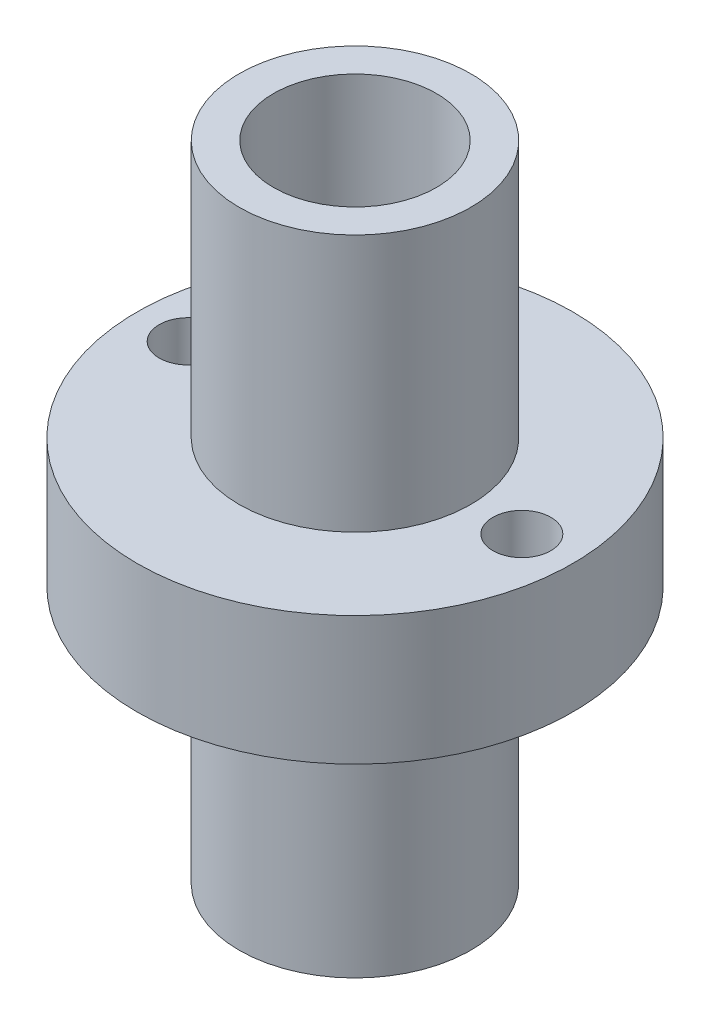
ISO-10303-21;
HEADER;
FILE_DESCRIPTION(('STEP AP214'),'2;1');
FILE_NAME('part.step','',(''),(''),'','','');
FILE_SCHEMA(('AUTOMOTIVE_DESIGN { 1 0 10303 214 1 1 1 1 }'));
ENDSEC;
DATA;
#1=APPLICATION_CONTEXT('core data for automotive mechanical design processes');
#2=APPLICATION_PROTOCOL_DEFINITION('international standard','automotive_design',2000,#1);
#3=PRODUCT_CONTEXT('',#1,'mechanical');
#4=PRODUCT('Part','Part','',(#3));
#5=PRODUCT_RELATED_PRODUCT_CATEGORY('part','',(#4));
#6=PRODUCT_DEFINITION_FORMATION('','',#4);
#7=PRODUCT_DEFINITION_CONTEXT('part definition',#1,'design');
#8=PRODUCT_DEFINITION('design','',#6,#7);
#9=PRODUCT_DEFINITION_SHAPE('','',#8);
#10=(LENGTH_UNIT() NAMED_UNIT(*) SI_UNIT(.MILLI.,.METRE.));
#11=(NAMED_UNIT(*) PLANE_ANGLE_UNIT() SI_UNIT($,.RADIAN.));
#12=(NAMED_UNIT(*) SI_UNIT($,.STERADIAN.) SOLID_ANGLE_UNIT());
#13=UNCERTAINTY_MEASURE_WITH_UNIT(LENGTH_MEASURE(1.E-05),#10,'distance_accuracy_value','');
#14=(GEOMETRIC_REPRESENTATION_CONTEXT(3) GLOBAL_UNCERTAINTY_ASSIGNED_CONTEXT((#13)) GLOBAL_UNIT_ASSIGNED_CONTEXT((#10,
#11,#12)) REPRESENTATION_CONTEXT('',''));
#15=CARTESIAN_POINT('',(0.,0.,0.));
#16=DIRECTION('',(0.,0.,1.));
#17=DIRECTION('',(1.,0.,0.));
#18=AXIS2_PLACEMENT_3D('',#15,#16,#17);
#19=CARTESIAN_POINT('',(13.5,37.5,0.));
#20=DIRECTION('',(0.,-1.,0.));
#21=DIRECTION('',(0.,0.,-1.));
#22=AXIS2_PLACEMENT_3D('',#19,#20,#21);
#23=PLANE('',#22);
#24=CARTESIAN_POINT('',(0.,37.5,0.));
#25=DIRECTION('',(0.,1.,0.));
#26=DIRECTION('',(0.,0.,1.));
#27=AXIS2_PLACEMENT_3D('',#24,#25,#26);
#28=CIRCLE('',#27,9.50000000000001);
#29=CARTESIAN_POINT('',(0.,37.5,9.50000000000001));
#30=VERTEX_POINT('',#29);
#31=EDGE_CURVE('E10',#30,#30,#28,.T.);
#32=ORIENTED_EDGE('',*,*,#31,.F.);
#33=EDGE_LOOP('',(#32));
#34=FACE_BOUND('',#33,.T.);
#35=CARTESIAN_POINT('',(0.,37.5,0.));
#36=DIRECTION('',(0.,1.,0.));
#37=DIRECTION('',(0.,0.,1.));
#38=AXIS2_PLACEMENT_3D('',#35,#36,#37);
#39=CIRCLE('',#38,13.5);
#40=CARTESIAN_POINT('',(0.,37.5,13.5));
#41=VERTEX_POINT('',#40);
#42=EDGE_CURVE('E59',#41,#41,#39,.T.);
#43=ORIENTED_EDGE('',*,*,#42,.T.);
#44=EDGE_LOOP('',(#43));
#45=FACE_BOUND('',#44,.T.);
#46=ADVANCED_FACE('F31',(#34,#45),#23,.F.);
#47=CARTESIAN_POINT('',(0.,0.,0.));
#48=DIRECTION('',(0.,1.,0.));
#49=DIRECTION('',(0.,0.,1.));
#50=AXIS2_PLACEMENT_3D('',#47,#48,#49);
#51=CYLINDRICAL_SURFACE('',#50,9.50000000000001);
#52=CARTESIAN_POINT('',(0.,-37.5,0.));
#53=DIRECTION('',(0.,1.,0.));
#54=DIRECTION('',(0.,0.,1.));
#55=AXIS2_PLACEMENT_3D('',#52,#53,#54);
#56=CIRCLE('',#55,9.50000000000001);
#57=CARTESIAN_POINT('',(0.,-37.5,9.50000000000001));
#58=VERTEX_POINT('',#57);
#59=EDGE_CURVE('E37',#58,#58,#56,.T.);
#60=ORIENTED_EDGE('',*,*,#59,.F.);
#61=EDGE_LOOP('',(#60));
#62=FACE_BOUND('',#61,.T.);
#63=ORIENTED_EDGE('',*,*,#31,.T.);
#64=EDGE_LOOP('',(#63));
#65=FACE_BOUND('',#64,.T.);
#66=ADVANCED_FACE('F110',(#62,#65),#51,.F.);
#67=CARTESIAN_POINT('',(13.5,-37.5,0.));
#68=DIRECTION('',(0.,1.,0.));
#69=DIRECTION('',(0.,0.,1.));
#70=AXIS2_PLACEMENT_3D('',#67,#68,#69);
#71=PLANE('',#70);
#72=CARTESIAN_POINT('',(0.,-37.5,0.));
#73=DIRECTION('',(0.,1.,0.));
#74=DIRECTION('',(0.,0.,1.));
#75=AXIS2_PLACEMENT_3D('',#72,#73,#74);
#76=CIRCLE('',#75,13.5);
#77=CARTESIAN_POINT('',(0.,-37.5,13.5));
#78=VERTEX_POINT('',#77);
#79=EDGE_CURVE('E41',#78,#78,#76,.T.);
#80=ORIENTED_EDGE('',*,*,#79,.F.);
#81=EDGE_LOOP('',(#80));
#82=FACE_BOUND('',#81,.T.);
#83=ORIENTED_EDGE('',*,*,#59,.T.);
#84=EDGE_LOOP('',(#83));
#85=FACE_BOUND('',#84,.T.);
#86=ADVANCED_FACE('F105',(#82,#85),#71,.F.);
#87=CARTESIAN_POINT('',(0.,0.,0.));
#88=DIRECTION('',(0.,1.,0.));
#89=DIRECTION('',(0.,0.,1.));
#90=AXIS2_PLACEMENT_3D('',#87,#88,#89);
#91=CYLINDRICAL_SURFACE('',#90,13.5);
#92=CARTESIAN_POINT('',(0.,-7.5,0.));
#93=DIRECTION('',(0.,1.,0.));
#94=DIRECTION('',(0.,0.,1.));
#95=AXIS2_PLACEMENT_3D('',#92,#93,#94);
#96=CIRCLE('',#95,13.5);
#97=CARTESIAN_POINT('',(0.,-7.5,13.5));
#98=VERTEX_POINT('',#97);
#99=EDGE_CURVE('E45',#98,#98,#96,.T.);
#100=ORIENTED_EDGE('',*,*,#99,.F.);
#101=EDGE_LOOP('',(#100));
#102=FACE_BOUND('',#101,.T.);
#103=ORIENTED_EDGE('',*,*,#79,.T.);
#104=EDGE_LOOP('',(#103));
#105=FACE_BOUND('',#104,.T.);
#106=ADVANCED_FACE('F98',(#102,#105),#91,.T.);
#107=CARTESIAN_POINT('',(25.4,-7.5,0.));
#108=DIRECTION('',(0.,1.,0.));
#109=DIRECTION('',(0.,0.,1.));
#110=AXIS2_PLACEMENT_3D('',#107,#108,#109);
#111=PLANE('',#110);
#112=CARTESIAN_POINT('',(19.45,-7.5,0.));
#113=DIRECTION('',(0.,1.,0.));
#114=DIRECTION('',(0.,0.,1.));
#115=AXIS2_PLACEMENT_3D('',#112,#113,#114);
#116=CIRCLE('',#115,3.37819999999999);
#117=CARTESIAN_POINT('',(19.45,-7.5,3.37819999999999));
#118=VERTEX_POINT('',#117);
#119=EDGE_CURVE('E68',#118,#118,#116,.T.);
#120=ORIENTED_EDGE('',*,*,#119,.T.);
#121=EDGE_LOOP('',(#120));
#122=FACE_BOUND('',#121,.T.);
#123=CARTESIAN_POINT('',(-19.45,-7.5,0.));
#124=DIRECTION('',(0.,1.,0.));
#125=DIRECTION('',(0.,0.,1.));
#126=AXIS2_PLACEMENT_3D('',#123,#124,#125);
#127=CIRCLE('',#126,3.37819999999999);
#128=CARTESIAN_POINT('',(-19.45,-7.5,3.37819999999999));
#129=VERTEX_POINT('',#128);
#130=EDGE_CURVE('E62',#129,#129,#127,.T.);
#131=ORIENTED_EDGE('',*,*,#130,.T.);
#132=EDGE_LOOP('',(#131));
#133=FACE_BOUND('',#132,.T.);
#134=CARTESIAN_POINT('',(0.,-7.5,0.));
#135=DIRECTION('',(0.,1.,0.));
#136=DIRECTION('',(0.,0.,1.));
#137=AXIS2_PLACEMENT_3D('',#134,#135,#136);
#138=CIRCLE('',#137,25.4);
#139=CARTESIAN_POINT('',(0.,-7.5,25.4));
#140=VERTEX_POINT('',#139);
#141=EDGE_CURVE('E50',#140,#140,#138,.T.);
#142=ORIENTED_EDGE('',*,*,#141,.F.);
#143=EDGE_LOOP('',(#142));
#144=FACE_BOUND('',#143,.T.);
#145=ORIENTED_EDGE('',*,*,#99,.T.);
#146=EDGE_LOOP('',(#145));
#147=FACE_BOUND('',#146,.T.);
#148=ADVANCED_FACE('F92',(#122,#133,#144,#147),#111,.F.);
#149=CARTESIAN_POINT('',(0.,0.,0.));
#150=DIRECTION('',(0.,1.,0.));
#151=DIRECTION('',(0.,0.,1.));
#152=AXIS2_PLACEMENT_3D('',#149,#150,#151);
#153=CYLINDRICAL_SURFACE('',#152,25.4);
#154=CARTESIAN_POINT('',(0.,7.5,0.));
#155=DIRECTION('',(0.,1.,0.));
#156=DIRECTION('',(0.,0.,1.));
#157=AXIS2_PLACEMENT_3D('',#154,#155,#156);
#158=CIRCLE('',#157,25.4);
#159=CARTESIAN_POINT('',(0.,7.5,25.4));
#160=VERTEX_POINT('',#159);
#161=EDGE_CURVE('E53',#160,#160,#158,.T.);
#162=ORIENTED_EDGE('',*,*,#161,.F.);
#163=EDGE_LOOP('',(#162));
#164=FACE_BOUND('',#163,.T.);
#165=ORIENTED_EDGE('',*,*,#141,.T.);
#166=EDGE_LOOP('',(#165));
#167=FACE_BOUND('',#166,.T.);
#168=ADVANCED_FACE('F82',(#164,#167),#153,.T.);
#169=CARTESIAN_POINT('',(25.4,7.5,0.));
#170=DIRECTION('',(0.,-1.,0.));
#171=DIRECTION('',(0.,0.,-1.));
#172=AXIS2_PLACEMENT_3D('',#169,#170,#171);
#173=PLANE('',#172);
#174=CARTESIAN_POINT('',(19.45,7.5,0.));
#175=DIRECTION('',(0.,1.,0.));
#176=DIRECTION('',(0.,0.,1.));
#177=AXIS2_PLACEMENT_3D('',#174,#175,#176);
#178=CIRCLE('',#177,3.37819999999999);
#179=CARTESIAN_POINT('',(19.45,7.5,3.37819999999999));
#180=VERTEX_POINT('',#179);
#181=EDGE_CURVE('E71',#180,#180,#178,.T.);
#182=ORIENTED_EDGE('',*,*,#181,.F.);
#183=EDGE_LOOP('',(#182));
#184=FACE_BOUND('',#183,.T.);
#185=CARTESIAN_POINT('',(-19.45,7.5,0.));
#186=DIRECTION('',(0.,1.,0.));
#187=DIRECTION('',(0.,0.,1.));
#188=AXIS2_PLACEMENT_3D('',#185,#186,#187);
#189=CIRCLE('',#188,3.37819999999999);
#190=CARTESIAN_POINT('',(-19.45,7.5,3.37819999999999));
#191=VERTEX_POINT('',#190);
#192=EDGE_CURVE('E65',#191,#191,#189,.T.);
#193=ORIENTED_EDGE('',*,*,#192,.F.);
#194=EDGE_LOOP('',(#193));
#195=FACE_BOUND('',#194,.T.);
#196=CARTESIAN_POINT('',(0.,7.5,0.));
#197=DIRECTION('',(0.,1.,0.));
#198=DIRECTION('',(0.,0.,1.));
#199=AXIS2_PLACEMENT_3D('',#196,#197,#198);
#200=CIRCLE('',#199,13.5);
#201=CARTESIAN_POINT('',(0.,7.5,13.5));
#202=VERTEX_POINT('',#201);
#203=EDGE_CURVE('E56',#202,#202,#200,.T.);
#204=ORIENTED_EDGE('',*,*,#203,.F.);
#205=EDGE_LOOP('',(#204));
#206=FACE_BOUND('',#205,.T.);
#207=ORIENTED_EDGE('',*,*,#161,.T.);
#208=EDGE_LOOP('',(#207));
#209=FACE_BOUND('',#208,.T.);
#210=ADVANCED_FACE('F78',(#184,#195,#206,#209),#173,.F.);
#211=CARTESIAN_POINT('',(0.,0.,0.));
#212=DIRECTION('',(0.,1.,0.));
#213=DIRECTION('',(0.,0.,1.));
#214=AXIS2_PLACEMENT_3D('',#211,#212,#213);
#215=CYLINDRICAL_SURFACE('',#214,13.5);
#216=ORIENTED_EDGE('',*,*,#42,.F.);
#217=EDGE_LOOP('',(#216));
#218=FACE_BOUND('',#217,.T.);
#219=ORIENTED_EDGE('',*,*,#203,.T.);
#220=EDGE_LOOP('',(#219));
#221=FACE_BOUND('',#220,.T.);
#222=ADVANCED_FACE('F81',(#218,#221),#215,.T.);
#223=CARTESIAN_POINT('',(-19.45,7.5,0.));
#224=DIRECTION('',(0.,1.,0.));
#225=DIRECTION('',(0.,0.,1.));
#226=AXIS2_PLACEMENT_3D('',#223,#224,#225);
#227=CYLINDRICAL_SURFACE('',#226,3.37819999999999);
#228=ORIENTED_EDGE('',*,*,#192,.T.);
#229=EDGE_LOOP('',(#228));
#230=FACE_BOUND('',#229,.T.);
#231=ORIENTED_EDGE('',*,*,#130,.F.);
#232=EDGE_LOOP('',(#231));
#233=FACE_BOUND('',#232,.T.);
#234=ADVANCED_FACE('F125',(#230,#233),#227,.F.);
#235=CARTESIAN_POINT('',(19.45,7.5,0.));
#236=DIRECTION('',(0.,1.,0.));
#237=DIRECTION('',(0.,0.,1.));
#238=AXIS2_PLACEMENT_3D('',#235,#236,#237);
#239=CYLINDRICAL_SURFACE('',#238,3.37819999999999);
#240=ORIENTED_EDGE('',*,*,#181,.T.);
#241=EDGE_LOOP('',(#240));
#242=FACE_BOUND('',#241,.T.);
#243=ORIENTED_EDGE('',*,*,#119,.F.);
#244=EDGE_LOOP('',(#243));
#245=FACE_BOUND('',#244,.T.);
#246=ADVANCED_FACE('F75',(#242,#245),#239,.F.);
#247=CLOSED_SHELL('',(#46,#66,#86,#106,#148,#168,#210,#222,#234,#246));
#248=MANIFOLD_SOLID_BREP('B2',#247);
#249=ADVANCED_BREP_SHAPE_REPRESENTATION('',(#18,#248),#14);
#250=SHAPE_DEFINITION_REPRESENTATION(#9,#249);
ENDSEC;
END-ISO-10303-21;
